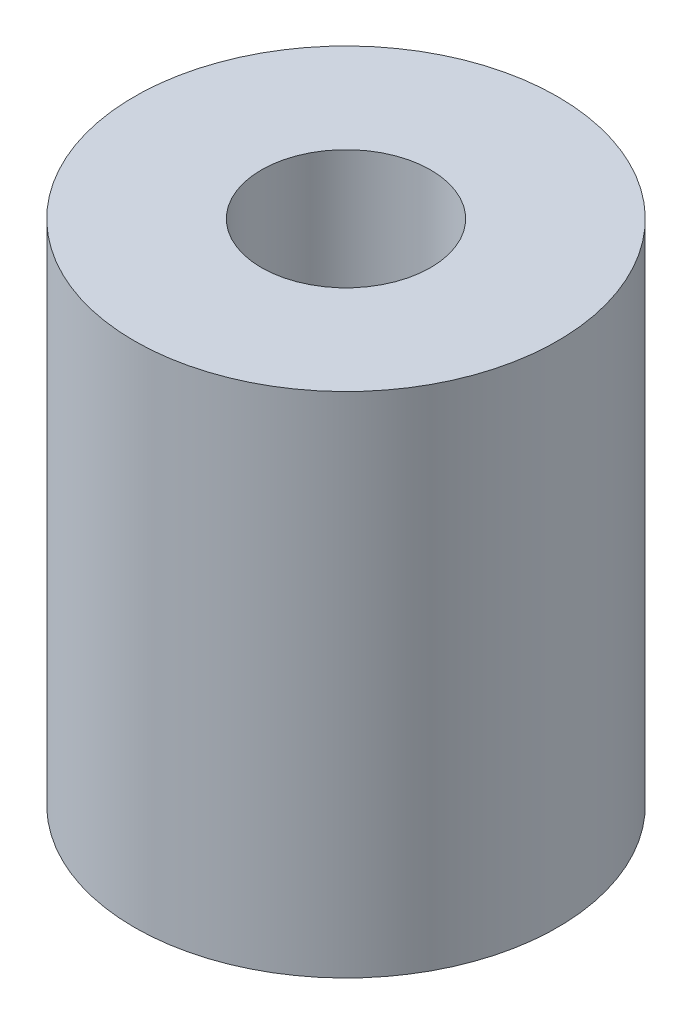
ISO-10303-21;
HEADER;
FILE_DESCRIPTION(('STEP AP214'),'2;1');
FILE_NAME('part.step','',(''),(''),'','','');
FILE_SCHEMA(('AUTOMOTIVE_DESIGN { 1 0 10303 214 1 1 1 1 }'));
ENDSEC;
DATA;
#1=APPLICATION_CONTEXT('core data for automotive mechanical design processes');
#2=APPLICATION_PROTOCOL_DEFINITION('international standard','automotive_design',2000,#1);
#3=PRODUCT_CONTEXT('',#1,'mechanical');
#4=PRODUCT('Part','Part','',(#3));
#5=PRODUCT_RELATED_PRODUCT_CATEGORY('part','',(#4));
#6=PRODUCT_DEFINITION_FORMATION('','',#4);
#7=PRODUCT_DEFINITION_CONTEXT('part definition',#1,'design');
#8=PRODUCT_DEFINITION('design','',#6,#7);
#9=PRODUCT_DEFINITION_SHAPE('','',#8);
#10=(LENGTH_UNIT() NAMED_UNIT(*) SI_UNIT(.MILLI.,.METRE.));
#11=(NAMED_UNIT(*) PLANE_ANGLE_UNIT() SI_UNIT($,.RADIAN.));
#12=(NAMED_UNIT(*) SI_UNIT($,.STERADIAN.) SOLID_ANGLE_UNIT());
#13=UNCERTAINTY_MEASURE_WITH_UNIT(LENGTH_MEASURE(1.E-05),#10,'distance_accuracy_value','');
#14=(GEOMETRIC_REPRESENTATION_CONTEXT(3) GLOBAL_UNCERTAINTY_ASSIGNED_CONTEXT((#13)) GLOBAL_UNIT_ASSIGNED_CONTEXT((#10,
#11,#12)) REPRESENTATION_CONTEXT('',''));
#15=CARTESIAN_POINT('',(0.,0.,0.));
#16=DIRECTION('',(0.,0.,1.));
#17=DIRECTION('',(1.,0.,0.));
#18=AXIS2_PLACEMENT_3D('',#15,#16,#17);
#19=CARTESIAN_POINT('',(0.,12.,0.));
#20=DIRECTION('',(0.,1.,0.));
#21=DIRECTION('',(0.,0.,1.));
#22=AXIS2_PLACEMENT_3D('',#19,#20,#21);
#23=PLANE('',#22);
#24=CARTESIAN_POINT('',(0.,12.,0.));
#25=DIRECTION('',(0.,1.,0.));
#26=DIRECTION('',(0.,0.,1.));
#27=AXIS2_PLACEMENT_3D('',#24,#25,#26);
#28=CIRCLE('',#27,5.);
#29=CARTESIAN_POINT('',(0.,12.,5.));
#30=VERTEX_POINT('',#29);
#31=EDGE_CURVE('E10',#30,#30,#28,.T.);
#32=ORIENTED_EDGE('',*,*,#31,.T.);
#33=EDGE_LOOP('',(#32));
#34=FACE_BOUND('',#33,.T.);
#35=CARTESIAN_POINT('',(0.,12.,0.));
#36=DIRECTION('',(0.,1.,0.));
#37=DIRECTION('',(0.,0.,1.));
#38=AXIS2_PLACEMENT_3D('',#35,#36,#37);
#39=CIRCLE('',#38,2.);
#40=CARTESIAN_POINT('',(0.,12.,2.));
#41=VERTEX_POINT('',#40);
#42=EDGE_CURVE('E50',#41,#41,#39,.T.);
#43=ORIENTED_EDGE('',*,*,#42,.F.);
#44=EDGE_LOOP('',(#43));
#45=FACE_BOUND('',#44,.T.);
#46=ADVANCED_FACE('F37',(#34,#45),#23,.T.);
#47=CARTESIAN_POINT('',(0.,0.,0.));
#48=DIRECTION('',(0.,1.,0.));
#49=DIRECTION('',(0.,0.,1.));
#50=AXIS2_PLACEMENT_3D('',#47,#48,#49);
#51=PLANE('',#50);
#52=CARTESIAN_POINT('',(0.,0.,0.));
#53=DIRECTION('',(0.,1.,0.));
#54=DIRECTION('',(0.,0.,1.));
#55=AXIS2_PLACEMENT_3D('',#52,#53,#54);
#56=CIRCLE('',#55,5.);
#57=CARTESIAN_POINT('',(0.,0.,5.));
#58=VERTEX_POINT('',#57);
#59=EDGE_CURVE('E41',#58,#58,#56,.T.);
#60=ORIENTED_EDGE('',*,*,#59,.F.);
#61=EDGE_LOOP('',(#60));
#62=FACE_BOUND('',#61,.T.);
#63=CARTESIAN_POINT('',(0.,0.,0.));
#64=DIRECTION('',(0.,1.,0.));
#65=DIRECTION('',(0.,0.,1.));
#66=AXIS2_PLACEMENT_3D('',#63,#64,#65);
#67=CIRCLE('',#66,2.);
#68=CARTESIAN_POINT('',(0.,0.,2.));
#69=VERTEX_POINT('',#68);
#70=EDGE_CURVE('E52',#69,#69,#67,.T.);
#71=ORIENTED_EDGE('',*,*,#70,.T.);
#72=EDGE_LOOP('',(#71));
#73=FACE_BOUND('',#72,.T.);
#74=ADVANCED_FACE('F64',(#62,#73),#51,.F.);
#75=CARTESIAN_POINT('',(0.,12.,0.));
#76=DIRECTION('',(0.,-1.,0.));
#77=DIRECTION('',(0.,0.,-1.));
#78=AXIS2_PLACEMENT_3D('',#75,#76,#77);
#79=CYLINDRICAL_SURFACE('',#78,5.);
#80=ORIENTED_EDGE('',*,*,#31,.F.);
#81=EDGE_LOOP('',(#80));
#82=FACE_BOUND('',#81,.T.);
#83=ORIENTED_EDGE('',*,*,#59,.T.);
#84=EDGE_LOOP('',(#83));
#85=FACE_BOUND('',#84,.T.);
#86=ADVANCED_FACE('F39',(#82,#85),#79,.T.);
#87=CARTESIAN_POINT('',(0.,12.,0.));
#88=DIRECTION('',(0.,-1.,0.));
#89=DIRECTION('',(0.,0.,-1.));
#90=AXIS2_PLACEMENT_3D('',#87,#88,#89);
#91=CYLINDRICAL_SURFACE('',#90,2.);
#92=ORIENTED_EDGE('',*,*,#42,.T.);
#93=EDGE_LOOP('',(#92));
#94=FACE_BOUND('',#93,.T.);
#95=ORIENTED_EDGE('',*,*,#70,.F.);
#96=EDGE_LOOP('',(#95));
#97=FACE_BOUND('',#96,.T.);
#98=ADVANCED_FACE('F60',(#94,#97),#91,.F.);
#99=CLOSED_SHELL('',(#46,#74,#86,#98));
#100=MANIFOLD_SOLID_BREP('B2',#99);
#101=ADVANCED_BREP_SHAPE_REPRESENTATION('',(#18,#100),#14);
#102=SHAPE_DEFINITION_REPRESENTATION(#9,#101);
ENDSEC;
END-ISO-10303-21;
